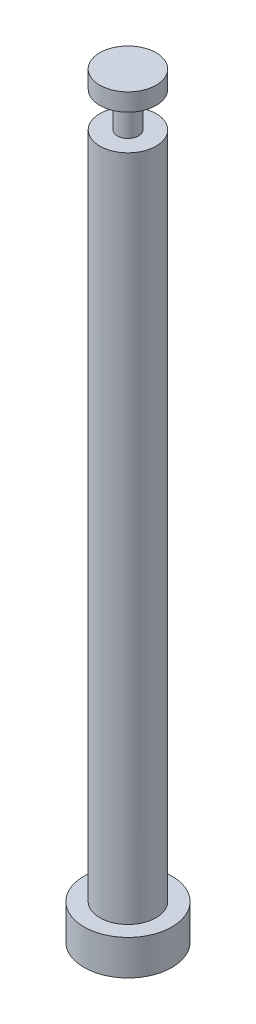
ISO-10303-21;
HEADER;
FILE_DESCRIPTION(('STEP AP214'),'2;1');
FILE_NAME('part.step','',(''),(''),'','','');
FILE_SCHEMA(('AUTOMOTIVE_DESIGN { 1 0 10303 214 1 1 1 1 }'));
ENDSEC;
DATA;
#1=APPLICATION_CONTEXT('core data for automotive mechanical design processes');
#2=APPLICATION_PROTOCOL_DEFINITION('international standard','automotive_design',2000,#1);
#3=PRODUCT_CONTEXT('',#1,'mechanical');
#4=PRODUCT('Part','Part','',(#3));
#5=PRODUCT_RELATED_PRODUCT_CATEGORY('part','',(#4));
#6=PRODUCT_DEFINITION_FORMATION('','',#4);
#7=PRODUCT_DEFINITION_CONTEXT('part definition',#1,'design');
#8=PRODUCT_DEFINITION('design','',#6,#7);
#9=PRODUCT_DEFINITION_SHAPE('','',#8);
#10=(LENGTH_UNIT() NAMED_UNIT(*) SI_UNIT(.MILLI.,.METRE.));
#11=(NAMED_UNIT(*) PLANE_ANGLE_UNIT() SI_UNIT($,.RADIAN.));
#12=(NAMED_UNIT(*) SI_UNIT($,.STERADIAN.) SOLID_ANGLE_UNIT());
#13=UNCERTAINTY_MEASURE_WITH_UNIT(LENGTH_MEASURE(1.E-05),#10,'distance_accuracy_value','');
#14=(GEOMETRIC_REPRESENTATION_CONTEXT(3) GLOBAL_UNCERTAINTY_ASSIGNED_CONTEXT((#13)) GLOBAL_UNIT_ASSIGNED_CONTEXT((#10,
#11,#12)) REPRESENTATION_CONTEXT('',''));
#15=CARTESIAN_POINT('',(0.,0.,0.));
#16=DIRECTION('',(0.,0.,1.));
#17=DIRECTION('',(1.,0.,0.));
#18=AXIS2_PLACEMENT_3D('',#15,#16,#17);
#19=CARTESIAN_POINT('',(0.,43.,0.));
#20=DIRECTION('',(0.,-1.,0.));
#21=DIRECTION('',(0.,0.,-1.));
#22=AXIS2_PLACEMENT_3D('',#19,#20,#21);
#23=CYLINDRICAL_SURFACE('',#22,1.6);
#24=CARTESIAN_POINT('',(0.,2.,0.));
#25=DIRECTION('',(0.,1.,0.));
#26=DIRECTION('',(0.,0.,1.));
#27=AXIS2_PLACEMENT_3D('',#24,#25,#26);
#28=CIRCLE('',#27,1.6);
#29=CARTESIAN_POINT('',(0.,2.,1.6));
#30=VERTEX_POINT('',#29);
#31=EDGE_CURVE('E36',#30,#30,#28,.T.);
#32=ORIENTED_EDGE('',*,*,#31,.T.);
#33=EDGE_LOOP('',(#32));
#34=FACE_BOUND('',#33,.T.);
#35=CARTESIAN_POINT('',(0.,40.,0.));
#36=DIRECTION('',(0.,-1.,0.));
#37=DIRECTION('',(0.,0.,-1.));
#38=AXIS2_PLACEMENT_3D('',#35,#36,#37);
#39=CIRCLE('',#38,1.6);
#40=CARTESIAN_POINT('',(0.,40.,-1.6));
#41=VERTEX_POINT('',#40);
#42=EDGE_CURVE('E40',#41,#41,#39,.T.);
#43=ORIENTED_EDGE('',*,*,#42,.T.);
#44=EDGE_LOOP('',(#43));
#45=FACE_BOUND('',#44,.T.);
#46=ADVANCED_FACE('F32',(#34,#45),#23,.T.);
#47=CARTESIAN_POINT('',(1.6,40.,0.));
#48=DIRECTION('',(0.,-1.,0.));
#49=DIRECTION('',(0.,0.,-1.));
#50=AXIS2_PLACEMENT_3D('',#47,#48,#49);
#51=PLANE('',#50);
#52=ORIENTED_EDGE('',*,*,#42,.F.);
#53=EDGE_LOOP('',(#52));
#54=FACE_BOUND('',#53,.T.);
#55=CARTESIAN_POINT('',(0.,40.,0.));
#56=DIRECTION('',(0.,-1.,0.));
#57=DIRECTION('',(0.,0.,-1.));
#58=AXIS2_PLACEMENT_3D('',#55,#56,#57);
#59=CIRCLE('',#58,0.6);
#60=CARTESIAN_POINT('',(0.,40.,-0.6));
#61=VERTEX_POINT('',#60);
#62=EDGE_CURVE('E44',#61,#61,#59,.T.);
#63=ORIENTED_EDGE('',*,*,#62,.T.);
#64=EDGE_LOOP('',(#63));
#65=FACE_BOUND('',#64,.T.);
#66=ADVANCED_FACE('F80',(#54,#65),#51,.F.);
#67=CARTESIAN_POINT('',(0.,0.,0.));
#68=DIRECTION('',(0.,-1.,0.));
#69=DIRECTION('',(0.,0.,-1.));
#70=AXIS2_PLACEMENT_3D('',#67,#68,#69);
#71=CYLINDRICAL_SURFACE('',#70,0.6);
#72=ORIENTED_EDGE('',*,*,#62,.F.);
#73=EDGE_LOOP('',(#72));
#74=FACE_BOUND('',#73,.T.);
#75=CARTESIAN_POINT('',(0.,42.,0.));
#76=DIRECTION('',(0.,-1.,0.));
#77=DIRECTION('',(0.,0.,-1.));
#78=AXIS2_PLACEMENT_3D('',#75,#76,#77);
#79=CIRCLE('',#78,0.6);
#80=CARTESIAN_POINT('',(0.,42.,-0.6));
#81=VERTEX_POINT('',#80);
#82=EDGE_CURVE('E49',#81,#81,#79,.T.);
#83=ORIENTED_EDGE('',*,*,#82,.T.);
#84=EDGE_LOOP('',(#83));
#85=FACE_BOUND('',#84,.T.);
#86=ADVANCED_FACE('F84',(#74,#85),#71,.T.);
#87=CARTESIAN_POINT('',(1.6,42.,0.));
#88=DIRECTION('',(0.,1.,0.));
#89=DIRECTION('',(0.,0.,1.));
#90=AXIS2_PLACEMENT_3D('',#87,#88,#89);
#91=PLANE('',#90);
#92=ORIENTED_EDGE('',*,*,#82,.F.);
#93=EDGE_LOOP('',(#92));
#94=FACE_BOUND('',#93,.T.);
#95=CARTESIAN_POINT('',(0.,42.,0.));
#96=DIRECTION('',(0.,-1.,0.));
#97=DIRECTION('',(0.,0.,-1.));
#98=AXIS2_PLACEMENT_3D('',#95,#96,#97);
#99=CIRCLE('',#98,1.6);
#100=CARTESIAN_POINT('',(0.,42.,-1.6));
#101=VERTEX_POINT('',#100);
#102=EDGE_CURVE('E52',#101,#101,#99,.T.);
#103=ORIENTED_EDGE('',*,*,#102,.T.);
#104=EDGE_LOOP('',(#103));
#105=FACE_BOUND('',#104,.T.);
#106=ADVANCED_FACE('F93',(#94,#105),#91,.F.);
#107=CARTESIAN_POINT('',(0.,43.,0.));
#108=DIRECTION('',(0.,1.,0.));
#109=DIRECTION('',(0.,0.,1.));
#110=AXIS2_PLACEMENT_3D('',#107,#108,#109);
#111=PLANE('',#110);
#112=CARTESIAN_POINT('',(0.,43.,0.));
#113=DIRECTION('',(0.,1.,0.));
#114=DIRECTION('',(0.,0.,1.));
#115=AXIS2_PLACEMENT_3D('',#112,#113,#114);
#116=CIRCLE('',#115,1.6);
#117=CARTESIAN_POINT('',(0.,43.,1.6));
#118=VERTEX_POINT('',#117);
#119=EDGE_CURVE('E10',#118,#118,#116,.T.);
#120=ORIENTED_EDGE('',*,*,#119,.T.);
#121=EDGE_LOOP('',(#120));
#122=FACE_BOUND('',#121,.T.);
#123=ADVANCED_FACE('F88',(#122),#111,.T.);
#124=ORIENTED_EDGE('',*,*,#102,.F.);
#125=EDGE_LOOP('',(#124));
#126=FACE_BOUND('',#125,.T.);
#127=ORIENTED_EDGE('',*,*,#119,.F.);
#128=EDGE_LOOP('',(#127));
#129=FACE_BOUND('',#128,.T.);
#130=ADVANCED_FACE('F34',(#126,#129),#23,.T.);
#131=CARTESIAN_POINT('',(0.,2.,0.));
#132=DIRECTION('',(0.,-1.,0.));
#133=DIRECTION('',(0.,0.,-1.));
#134=AXIS2_PLACEMENT_3D('',#131,#132,#133);
#135=CYLINDRICAL_SURFACE('',#134,2.5);
#136=CARTESIAN_POINT('',(0.,2.,0.));
#137=DIRECTION('',(0.,1.,0.));
#138=DIRECTION('',(0.,0.,1.));
#139=AXIS2_PLACEMENT_3D('',#136,#137,#138);
#140=CIRCLE('',#139,2.5);
#141=CARTESIAN_POINT('',(0.,2.,2.5));
#142=VERTEX_POINT('',#141);
#143=EDGE_CURVE('E58',#142,#142,#140,.T.);
#144=ORIENTED_EDGE('',*,*,#143,.F.);
#145=EDGE_LOOP('',(#144));
#146=FACE_BOUND('',#145,.T.);
#147=CARTESIAN_POINT('',(0.,0.,0.));
#148=DIRECTION('',(0.,1.,0.));
#149=DIRECTION('',(0.,0.,1.));
#150=AXIS2_PLACEMENT_3D('',#147,#148,#149);
#151=CIRCLE('',#150,2.5);
#152=CARTESIAN_POINT('',(0.,0.,2.5));
#153=VERTEX_POINT('',#152);
#154=EDGE_CURVE('E55',#153,#153,#151,.T.);
#155=ORIENTED_EDGE('',*,*,#154,.T.);
#156=EDGE_LOOP('',(#155));
#157=FACE_BOUND('',#156,.T.);
#158=ADVANCED_FACE('F70',(#146,#157),#135,.T.);
#159=CARTESIAN_POINT('',(0.,2.,0.));
#160=DIRECTION('',(0.,1.,0.));
#161=DIRECTION('',(0.,0.,1.));
#162=AXIS2_PLACEMENT_3D('',#159,#160,#161);
#163=PLANE('',#162);
#164=ORIENTED_EDGE('',*,*,#31,.F.);
#165=EDGE_LOOP('',(#164));
#166=FACE_BOUND('',#165,.T.);
#167=ORIENTED_EDGE('',*,*,#143,.T.);
#168=EDGE_LOOP('',(#167));
#169=FACE_BOUND('',#168,.T.);
#170=ADVANCED_FACE('F67',(#166,#169),#163,.T.);
#171=CARTESIAN_POINT('',(0.,0.,0.));
#172=DIRECTION('',(0.,1.,0.));
#173=DIRECTION('',(0.,0.,1.));
#174=AXIS2_PLACEMENT_3D('',#171,#172,#173);
#175=PLANE('',#174);
#176=ORIENTED_EDGE('',*,*,#154,.F.);
#177=EDGE_LOOP('',(#176));
#178=FACE_BOUND('',#177,.T.);
#179=ADVANCED_FACE('F69',(#178),#175,.F.);
#180=CLOSED_SHELL('',(#46,#66,#86,#106,#123,#130,#158,#170,#179));
#181=MANIFOLD_SOLID_BREP('B2',#180);
#182=ADVANCED_BREP_SHAPE_REPRESENTATION('',(#18,#181),#14);
#183=SHAPE_DEFINITION_REPRESENTATION(#9,#182);
ENDSEC;
END-ISO-10303-21;
